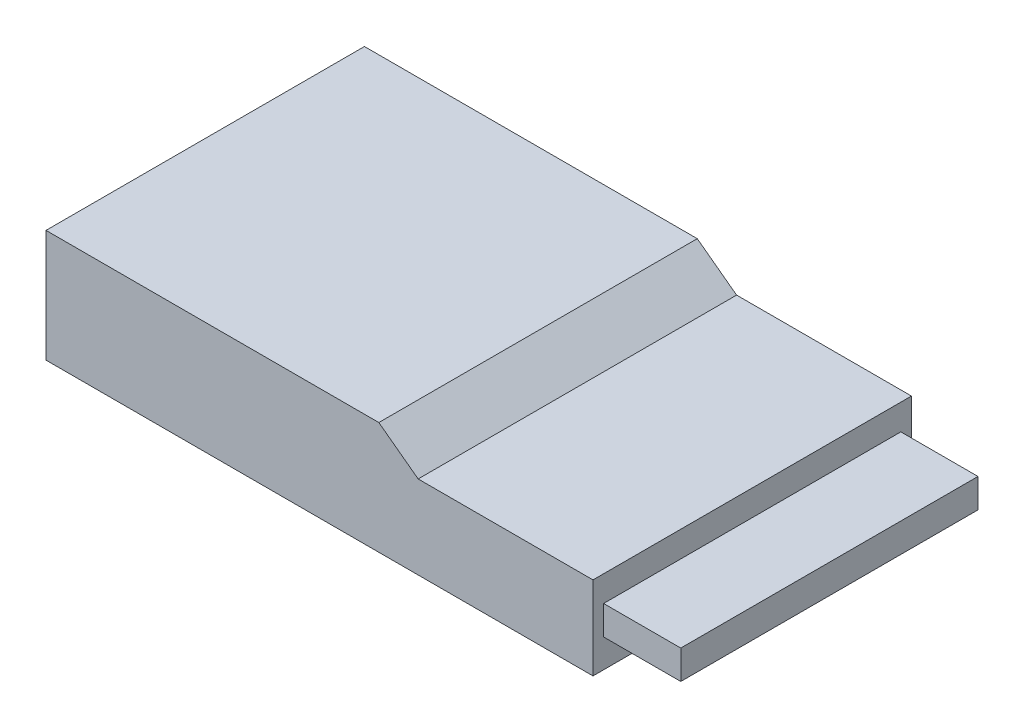
ISO-10303-21;
HEADER;
FILE_DESCRIPTION(('STEP AP214'),'2;1');
FILE_NAME('part.step','',(''),(''),'','','');
FILE_SCHEMA(('AUTOMOTIVE_DESIGN { 1 0 10303 214 1 1 1 1 }'));
ENDSEC;
DATA;
#1=APPLICATION_CONTEXT('core data for automotive mechanical design processes');
#2=APPLICATION_PROTOCOL_DEFINITION('international standard','automotive_design',2000,#1);
#3=PRODUCT_CONTEXT('',#1,'mechanical');
#4=PRODUCT('Part','Part','',(#3));
#5=PRODUCT_RELATED_PRODUCT_CATEGORY('part','',(#4));
#6=PRODUCT_DEFINITION_FORMATION('','',#4);
#7=PRODUCT_DEFINITION_CONTEXT('part definition',#1,'design');
#8=PRODUCT_DEFINITION('design','',#6,#7);
#9=PRODUCT_DEFINITION_SHAPE('','',#8);
#10=(LENGTH_UNIT() NAMED_UNIT(*) SI_UNIT(.MILLI.,.METRE.));
#11=(NAMED_UNIT(*) PLANE_ANGLE_UNIT() SI_UNIT($,.RADIAN.));
#12=(NAMED_UNIT(*) SI_UNIT($,.STERADIAN.) SOLID_ANGLE_UNIT());
#13=UNCERTAINTY_MEASURE_WITH_UNIT(LENGTH_MEASURE(1.E-05),#10,'distance_accuracy_value','');
#14=(GEOMETRIC_REPRESENTATION_CONTEXT(3) GLOBAL_UNCERTAINTY_ASSIGNED_CONTEXT((#13)) GLOBAL_UNIT_ASSIGNED_CONTEXT((#10,
#11,#12)) REPRESENTATION_CONTEXT('',''));
#15=CARTESIAN_POINT('',(0.,0.,0.));
#16=DIRECTION('',(0.,0.,1.));
#17=DIRECTION('',(1.,0.,0.));
#18=AXIS2_PLACEMENT_3D('',#15,#16,#17);
#19=CARTESIAN_POINT('',(10.95,4.5,-6.375));
#20=DIRECTION('',(-1.,0.,0.));
#21=DIRECTION('',(0.,0.,1.));
#22=AXIS2_PLACEMENT_3D('',#19,#20,#21);
#23=PLANE('',#22);
#24=DIRECTION('',(0.,-1.,0.));
#25=VECTOR('',#24,1.);
#26=CARTESIAN_POINT('',(10.95,4.5,-6.375));
#27=LINE('',#26,#25);
#28=CARTESIAN_POINT('',(10.95,3.33080681124754,-6.375));
#29=VERTEX_POINT('',#28);
#30=CARTESIAN_POINT('',(10.95,0.,-6.375));
#31=VERTEX_POINT('',#30);
#32=EDGE_CURVE('E53',#29,#31,#27,.T.);
#33=ORIENTED_EDGE('',*,*,#32,.F.);
#34=DIRECTION('',(0.,0.,1.));
#35=VECTOR('',#34,1.);
#36=CARTESIAN_POINT('',(10.95,3.33080681124754,-6.625));
#37=LINE('',#36,#35);
#38=CARTESIAN_POINT('',(10.95,3.33080681124754,6.375));
#39=VERTEX_POINT('',#38);
#40=EDGE_CURVE('E186',#29,#39,#37,.T.);
#41=ORIENTED_EDGE('',*,*,#40,.T.);
#42=DIRECTION('',(0.,-1.,0.));
#43=VECTOR('',#42,1.);
#44=CARTESIAN_POINT('',(10.95,4.5,6.375));
#45=LINE('',#44,#43);
#46=CARTESIAN_POINT('',(10.95,0.,6.375));
#47=VERTEX_POINT('',#46);
#48=EDGE_CURVE('E141',#39,#47,#45,.T.);
#49=ORIENTED_EDGE('',*,*,#48,.T.);
#50=DIRECTION('',(0.,0.,-1.));
#51=VECTOR('',#50,1.);
#52=CARTESIAN_POINT('',(10.95,0.,-6.375));
#53=LINE('',#52,#51);
#54=EDGE_CURVE('E151',#47,#31,#53,.T.);
#55=ORIENTED_EDGE('',*,*,#54,.T.);
#56=EDGE_LOOP('',(#33,#41,#49,#55));
#57=FACE_BOUND('',#56,.T.);
#58=DIRECTION('',(0.,0.,-1.));
#59=VECTOR('',#58,1.);
#60=CARTESIAN_POINT('',(10.95,1.14,-5.95));
#61=LINE('',#60,#59);
#62=CARTESIAN_POINT('',(10.95,1.14,5.95));
#63=VERTEX_POINT('',#62);
#64=CARTESIAN_POINT('',(10.95,1.14,-5.95));
#65=VERTEX_POINT('',#64);
#66=EDGE_CURVE('E217',#63,#65,#61,.T.);
#67=ORIENTED_EDGE('',*,*,#66,.F.);
#68=DIRECTION('',(0.,-1.,0.));
#69=VECTOR('',#68,1.);
#70=CARTESIAN_POINT('',(10.95,1.14,5.95));
#71=LINE('',#70,#69);
#72=CARTESIAN_POINT('',(10.95,2.3,5.95));
#73=VERTEX_POINT('',#72);
#74=EDGE_CURVE('E206',#73,#63,#71,.T.);
#75=ORIENTED_EDGE('',*,*,#74,.F.);
#76=DIRECTION('',(0.,0.,1.));
#77=VECTOR('',#76,1.);
#78=CARTESIAN_POINT('',(10.95,2.3,5.95));
#79=LINE('',#78,#77);
#80=CARTESIAN_POINT('',(10.95,2.3,-5.95));
#81=VERTEX_POINT('',#80);
#82=EDGE_CURVE('E211',#81,#73,#79,.T.);
#83=ORIENTED_EDGE('',*,*,#82,.F.);
#84=DIRECTION('',(0.,1.,0.));
#85=VECTOR('',#84,1.);
#86=CARTESIAN_POINT('',(10.95,2.3,-5.95));
#87=LINE('',#86,#85);
#88=EDGE_CURVE('E67',#65,#81,#87,.T.);
#89=ORIENTED_EDGE('',*,*,#88,.F.);
#90=EDGE_LOOP('',(#67,#75,#83,#89));
#91=FACE_BOUND('',#90,.T.);
#92=ADVANCED_FACE('F45',(#57,#91),#23,.F.);
#93=CARTESIAN_POINT('',(-10.95,4.5,-6.375));
#94=DIRECTION('',(0.,0.,1.));
#95=DIRECTION('',(1.,0.,0.));
#96=AXIS2_PLACEMENT_3D('',#93,#94,#95);
#97=PLANE('',#96);
#98=DIRECTION('',(0.802772420400116,-0.596285536504902,0.));
#99=VECTOR('',#98,1.);
#100=CARTESIAN_POINT('',(-6.2118802753108,10.8788765728397,-6.375));
#101=LINE('',#100,#99);
#102=CARTESIAN_POINT('',(2.37592853827769,4.5,-6.375));
#103=VERTEX_POINT('',#102);
#104=CARTESIAN_POINT('',(3.95,3.33080681124754,-6.375));
#105=VERTEX_POINT('',#104);
#106=EDGE_CURVE('E59',#103,#105,#101,.T.);
#107=ORIENTED_EDGE('',*,*,#106,.T.);
#108=DIRECTION('',(1.,0.,0.));
#109=VECTOR('',#108,1.);
#110=CARTESIAN_POINT('',(-10.95,3.33080681124753,-6.375));
#111=LINE('',#110,#109);
#112=EDGE_CURVE('E178',#105,#29,#111,.T.);
#113=ORIENTED_EDGE('',*,*,#112,.T.);
#114=ORIENTED_EDGE('',*,*,#32,.T.);
#115=DIRECTION('',(-1.,0.,0.));
#116=VECTOR('',#115,1.);
#117=CARTESIAN_POINT('',(-10.95,0.,-6.375));
#118=LINE('',#117,#116);
#119=CARTESIAN_POINT('',(-10.95,0.,-6.375));
#120=VERTEX_POINT('',#119);
#121=EDGE_CURVE('E155',#31,#120,#118,.T.);
#122=ORIENTED_EDGE('',*,*,#121,.T.);
#123=DIRECTION('',(0.,-1.,0.));
#124=VECTOR('',#123,1.);
#125=CARTESIAN_POINT('',(-10.95,4.5,-6.375));
#126=LINE('',#125,#124);
#127=CARTESIAN_POINT('',(-10.95,4.5,-6.375));
#128=VERTEX_POINT('',#127);
#129=EDGE_CURVE('E168',#128,#120,#126,.T.);
#130=ORIENTED_EDGE('',*,*,#129,.F.);
#131=DIRECTION('',(-1.,0.,0.));
#132=VECTOR('',#131,1.);
#133=CARTESIAN_POINT('',(-10.95,4.5,-6.375));
#134=LINE('',#133,#132);
#135=EDGE_CURVE('E147',#103,#128,#134,.T.);
#136=ORIENTED_EDGE('',*,*,#135,.F.);
#137=EDGE_LOOP('',(#107,#113,#114,#122,#130,#136));
#138=FACE_BOUND('',#137,.T.);
#139=ADVANCED_FACE('F176',(#138),#97,.F.);
#140=CARTESIAN_POINT('',(-10.95,4.5,-6.375));
#141=DIRECTION('',(1.,0.,0.));
#142=DIRECTION('',(0.,0.,-1.));
#143=AXIS2_PLACEMENT_3D('',#140,#141,#142);
#144=PLANE('',#143);
#145=DIRECTION('',(0.,0.,1.));
#146=VECTOR('',#145,1.);
#147=CARTESIAN_POINT('',(-10.95,0.,-6.375));
#148=LINE('',#147,#146);
#149=CARTESIAN_POINT('',(-10.95,0.,6.375));
#150=VERTEX_POINT('',#149);
#151=EDGE_CURVE('E159',#120,#150,#148,.T.);
#152=ORIENTED_EDGE('',*,*,#151,.T.);
#153=DIRECTION('',(0.,-1.,0.));
#154=VECTOR('',#153,1.);
#155=CARTESIAN_POINT('',(-10.95,4.5,6.375));
#156=LINE('',#155,#154);
#157=CARTESIAN_POINT('',(-10.95,4.5,6.375));
#158=VERTEX_POINT('',#157);
#159=EDGE_CURVE('E145',#158,#150,#156,.T.);
#160=ORIENTED_EDGE('',*,*,#159,.F.);
#161=DIRECTION('',(0.,0.,1.));
#162=VECTOR('',#161,1.);
#163=CARTESIAN_POINT('',(-10.95,4.5,-6.375));
#164=LINE('',#163,#162);
#165=EDGE_CURVE('E138',#128,#158,#164,.T.);
#166=ORIENTED_EDGE('',*,*,#165,.F.);
#167=ORIENTED_EDGE('',*,*,#129,.T.);
#168=EDGE_LOOP('',(#152,#160,#166,#167));
#169=FACE_BOUND('',#168,.T.);
#170=ADVANCED_FACE('F188',(#169),#144,.F.);
#171=CARTESIAN_POINT('',(-10.95,4.5,6.375));
#172=DIRECTION('',(0.,0.,-1.));
#173=DIRECTION('',(-1.,0.,0.));
#174=AXIS2_PLACEMENT_3D('',#171,#172,#173);
#175=PLANE('',#174);
#176=ORIENTED_EDGE('',*,*,#48,.F.);
#177=DIRECTION('',(1.,0.,0.));
#178=VECTOR('',#177,1.);
#179=CARTESIAN_POINT('',(10.95,3.33080681124754,6.375));
#180=LINE('',#179,#178);
#181=CARTESIAN_POINT('',(3.95,3.33080681124754,6.375));
#182=VERTEX_POINT('',#181);
#183=EDGE_CURVE('E133',#182,#39,#180,.T.);
#184=ORIENTED_EDGE('',*,*,#183,.F.);
#185=DIRECTION('',(0.802772420400116,-0.596285536504902,0.));
#186=VECTOR('',#185,1.);
#187=CARTESIAN_POINT('',(3.95,3.33080681124754,6.375));
#188=LINE('',#187,#186);
#189=CARTESIAN_POINT('',(2.37592853827769,4.5,6.375));
#190=VERTEX_POINT('',#189);
#191=EDGE_CURVE('E122',#190,#182,#188,.T.);
#192=ORIENTED_EDGE('',*,*,#191,.F.);
#193=DIRECTION('',(1.,0.,0.));
#194=VECTOR('',#193,1.);
#195=CARTESIAN_POINT('',(-10.95,4.5,6.375));
#196=LINE('',#195,#194);
#197=EDGE_CURVE('E132',#158,#190,#196,.T.);
#198=ORIENTED_EDGE('',*,*,#197,.F.);
#199=ORIENTED_EDGE('',*,*,#159,.T.);
#200=DIRECTION('',(1.,0.,0.));
#201=VECTOR('',#200,1.);
#202=CARTESIAN_POINT('',(-10.95,0.,6.375));
#203=LINE('',#202,#201);
#204=EDGE_CURVE('E162',#150,#47,#203,.T.);
#205=ORIENTED_EDGE('',*,*,#204,.T.);
#206=EDGE_LOOP('',(#176,#184,#192,#198,#199,#205));
#207=FACE_BOUND('',#206,.T.);
#208=ADVANCED_FACE('F130',(#207),#175,.F.);
#209=CARTESIAN_POINT('',(0.,4.5,0.));
#210=DIRECTION('',(0.,1.,0.));
#211=DIRECTION('',(0.,0.,1.));
#212=AXIS2_PLACEMENT_3D('',#209,#210,#211);
#213=PLANE('',#212);
#214=DIRECTION('',(0.,0.,1.));
#215=VECTOR('',#214,1.);
#216=CARTESIAN_POINT('',(2.37592853827769,4.5,0.));
#217=LINE('',#216,#215);
#218=EDGE_CURVE('E11',#103,#190,#217,.T.);
#219=ORIENTED_EDGE('',*,*,#218,.F.);
#220=ORIENTED_EDGE('',*,*,#135,.T.);
#221=ORIENTED_EDGE('',*,*,#165,.T.);
#222=ORIENTED_EDGE('',*,*,#197,.T.);
#223=EDGE_LOOP('',(#219,#220,#221,#222));
#224=FACE_BOUND('',#223,.T.);
#225=ADVANCED_FACE('F136',(#224),#213,.T.);
#226=CARTESIAN_POINT('',(0.,0.,0.));
#227=DIRECTION('',(0.,1.,0.));
#228=DIRECTION('',(0.,0.,1.));
#229=AXIS2_PLACEMENT_3D('',#226,#227,#228);
#230=PLANE('',#229);
#231=ORIENTED_EDGE('',*,*,#54,.F.);
#232=ORIENTED_EDGE('',*,*,#204,.F.);
#233=ORIENTED_EDGE('',*,*,#151,.F.);
#234=ORIENTED_EDGE('',*,*,#121,.F.);
#235=EDGE_LOOP('',(#231,#232,#233,#234));
#236=FACE_BOUND('',#235,.T.);
#237=ADVANCED_FACE('F184',(#236),#230,.F.);
#238=CARTESIAN_POINT('',(14.04,1.14,-5.95));
#239=DIRECTION('',(0.,1.,0.));
#240=DIRECTION('',(0.,0.,1.));
#241=AXIS2_PLACEMENT_3D('',#238,#239,#240);
#242=PLANE('',#241);
#243=ORIENTED_EDGE('',*,*,#66,.T.);
#244=DIRECTION('',(-1.,0.,0.));
#245=VECTOR('',#244,1.);
#246=CARTESIAN_POINT('',(14.04,1.14,-5.95));
#247=LINE('',#246,#245);
#248=CARTESIAN_POINT('',(14.04,1.14,-5.95));
#249=VERTEX_POINT('',#248);
#250=EDGE_CURVE('E156',#249,#65,#247,.T.);
#251=ORIENTED_EDGE('',*,*,#250,.F.);
#252=DIRECTION('',(0.,0.,-1.));
#253=VECTOR('',#252,1.);
#254=CARTESIAN_POINT('',(14.04,1.14,-5.95));
#255=LINE('',#254,#253);
#256=CARTESIAN_POINT('',(14.04,1.14,5.95));
#257=VERTEX_POINT('',#256);
#258=EDGE_CURVE('E210',#257,#249,#255,.T.);
#259=ORIENTED_EDGE('',*,*,#258,.F.);
#260=DIRECTION('',(-1.,0.,0.));
#261=VECTOR('',#260,1.);
#262=CARTESIAN_POINT('',(14.04,1.14,5.95));
#263=LINE('',#262,#261);
#264=EDGE_CURVE('E201',#257,#63,#263,.T.);
#265=ORIENTED_EDGE('',*,*,#264,.T.);
#266=EDGE_LOOP('',(#243,#251,#259,#265));
#267=FACE_BOUND('',#266,.T.);
#268=ADVANCED_FACE('F269',(#267),#242,.F.);
#269=CARTESIAN_POINT('',(14.04,2.3,-5.95));
#270=DIRECTION('',(0.,0.,1.));
#271=DIRECTION('',(1.,0.,0.));
#272=AXIS2_PLACEMENT_3D('',#269,#270,#271);
#273=PLANE('',#272);
#274=ORIENTED_EDGE('',*,*,#88,.T.);
#275=DIRECTION('',(-1.,0.,0.));
#276=VECTOR('',#275,1.);
#277=CARTESIAN_POINT('',(14.04,2.3,-5.95));
#278=LINE('',#277,#276);
#279=CARTESIAN_POINT('',(14.04,2.3,-5.95));
#280=VERTEX_POINT('',#279);
#281=EDGE_CURVE('E193',#280,#81,#278,.T.);
#282=ORIENTED_EDGE('',*,*,#281,.F.);
#283=DIRECTION('',(0.,1.,0.));
#284=VECTOR('',#283,1.);
#285=CARTESIAN_POINT('',(14.04,2.3,-5.95));
#286=LINE('',#285,#284);
#287=EDGE_CURVE('E226',#249,#280,#286,.T.);
#288=ORIENTED_EDGE('',*,*,#287,.F.);
#289=ORIENTED_EDGE('',*,*,#250,.T.);
#290=EDGE_LOOP('',(#274,#282,#288,#289));
#291=FACE_BOUND('',#290,.T.);
#292=ADVANCED_FACE('F273',(#291),#273,.F.);
#293=CARTESIAN_POINT('',(14.04,2.3,5.95));
#294=DIRECTION('',(0.,-1.,0.));
#295=DIRECTION('',(0.,0.,-1.));
#296=AXIS2_PLACEMENT_3D('',#293,#294,#295);
#297=PLANE('',#296);
#298=ORIENTED_EDGE('',*,*,#82,.T.);
#299=DIRECTION('',(-1.,0.,0.));
#300=VECTOR('',#299,1.);
#301=CARTESIAN_POINT('',(14.04,2.3,5.95));
#302=LINE('',#301,#300);
#303=CARTESIAN_POINT('',(14.04,2.3,5.95));
#304=VERTEX_POINT('',#303);
#305=EDGE_CURVE('E197',#304,#73,#302,.T.);
#306=ORIENTED_EDGE('',*,*,#305,.F.);
#307=DIRECTION('',(0.,0.,1.));
#308=VECTOR('',#307,1.);
#309=CARTESIAN_POINT('',(14.04,2.3,5.95));
#310=LINE('',#309,#308);
#311=EDGE_CURVE('E223',#280,#304,#310,.T.);
#312=ORIENTED_EDGE('',*,*,#311,.F.);
#313=ORIENTED_EDGE('',*,*,#281,.T.);
#314=EDGE_LOOP('',(#298,#306,#312,#313));
#315=FACE_BOUND('',#314,.T.);
#316=ADVANCED_FACE('F277',(#315),#297,.F.);
#317=CARTESIAN_POINT('',(14.04,1.14,5.95));
#318=DIRECTION('',(0.,0.,-1.));
#319=DIRECTION('',(-1.,0.,0.));
#320=AXIS2_PLACEMENT_3D('',#317,#318,#319);
#321=PLANE('',#320);
#322=ORIENTED_EDGE('',*,*,#74,.T.);
#323=ORIENTED_EDGE('',*,*,#264,.F.);
#324=DIRECTION('',(0.,-1.,0.));
#325=VECTOR('',#324,1.);
#326=CARTESIAN_POINT('',(14.04,1.14,5.95));
#327=LINE('',#326,#325);
#328=EDGE_CURVE('E205',#304,#257,#327,.T.);
#329=ORIENTED_EDGE('',*,*,#328,.F.);
#330=ORIENTED_EDGE('',*,*,#305,.T.);
#331=EDGE_LOOP('',(#322,#323,#329,#330));
#332=FACE_BOUND('',#331,.T.);
#333=ADVANCED_FACE('F253',(#332),#321,.F.);
#334=CARTESIAN_POINT('',(14.04,0.,0.));
#335=DIRECTION('',(-1.,0.,0.));
#336=DIRECTION('',(0.,0.,1.));
#337=AXIS2_PLACEMENT_3D('',#334,#335,#336);
#338=PLANE('',#337);
#339=ORIENTED_EDGE('',*,*,#258,.T.);
#340=ORIENTED_EDGE('',*,*,#287,.T.);
#341=ORIENTED_EDGE('',*,*,#311,.T.);
#342=ORIENTED_EDGE('',*,*,#328,.T.);
#343=EDGE_LOOP('',(#339,#340,#341,#342));
#344=FACE_BOUND('',#343,.T.);
#345=ADVANCED_FACE('F245',(#344),#338,.F.);
#346=CARTESIAN_POINT('',(10.95,3.33080681124754,-6.625));
#347=DIRECTION('',(0.,-1.,0.));
#348=DIRECTION('',(1.,0.,0.));
#349=AXIS2_PLACEMENT_3D('',#346,#347,#348);
#350=PLANE('',#349);
#351=DIRECTION('',(0.,0.,1.));
#352=VECTOR('',#351,1.);
#353=CARTESIAN_POINT('',(3.95,3.33080681124754,-6.625));
#354=LINE('',#353,#352);
#355=EDGE_CURVE('E236',#105,#182,#354,.T.);
#356=ORIENTED_EDGE('',*,*,#355,.T.);
#357=ORIENTED_EDGE('',*,*,#183,.T.);
#358=ORIENTED_EDGE('',*,*,#40,.F.);
#359=ORIENTED_EDGE('',*,*,#112,.F.);
#360=EDGE_LOOP('',(#356,#357,#358,#359));
#361=FACE_BOUND('',#360,.T.);
#362=ADVANCED_FACE('F243',(#361),#350,.F.);
#363=CARTESIAN_POINT('',(3.95,3.33080681124754,-6.625));
#364=DIRECTION('',(-0.596285536504902,-0.802772420400116,0.));
#365=DIRECTION('',(0.802772420400116,-0.596285536504902,0.));
#366=AXIS2_PLACEMENT_3D('',#363,#364,#365);
#367=PLANE('',#366);
#368=ORIENTED_EDGE('',*,*,#218,.T.);
#369=ORIENTED_EDGE('',*,*,#191,.T.);
#370=ORIENTED_EDGE('',*,*,#355,.F.);
#371=ORIENTED_EDGE('',*,*,#106,.F.);
#372=EDGE_LOOP('',(#368,#369,#370,#371));
#373=FACE_BOUND('',#372,.T.);
#374=ADVANCED_FACE('F121',(#373),#367,.F.);
#375=CLOSED_SHELL('',(#92,#139,#170,#208,#225,#237,#268,#292,#316,#333,#345,#362,#374));
#376=MANIFOLD_SOLID_BREP('B2',#375);
#377=ADVANCED_BREP_SHAPE_REPRESENTATION('',(#18,#376),#14);
#378=SHAPE_DEFINITION_REPRESENTATION(#9,#377);
ENDSEC;
END-ISO-10303-21;
